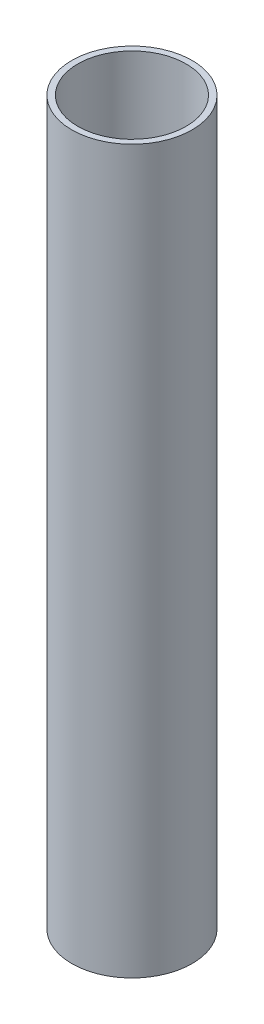
ISO-10303-21;
HEADER;
FILE_DESCRIPTION(('STEP AP214'),'2;1');
FILE_NAME('part.step','',(''),(''),'','','');
FILE_SCHEMA(('AUTOMOTIVE_DESIGN { 1 0 10303 214 1 1 1 1 }'));
ENDSEC;
DATA;
#1=APPLICATION_CONTEXT('core data for automotive mechanical design processes');
#2=APPLICATION_PROTOCOL_DEFINITION('international standard','automotive_design',2000,#1);
#3=PRODUCT_CONTEXT('',#1,'mechanical');
#4=PRODUCT('Part','Part','',(#3));
#5=PRODUCT_RELATED_PRODUCT_CATEGORY('part','',(#4));
#6=PRODUCT_DEFINITION_FORMATION('','',#4);
#7=PRODUCT_DEFINITION_CONTEXT('part definition',#1,'design');
#8=PRODUCT_DEFINITION('design','',#6,#7);
#9=PRODUCT_DEFINITION_SHAPE('','',#8);
#10=(LENGTH_UNIT() NAMED_UNIT(*) SI_UNIT(.MILLI.,.METRE.));
#11=(NAMED_UNIT(*) PLANE_ANGLE_UNIT() SI_UNIT($,.RADIAN.));
#12=(NAMED_UNIT(*) SI_UNIT($,.STERADIAN.) SOLID_ANGLE_UNIT());
#13=UNCERTAINTY_MEASURE_WITH_UNIT(LENGTH_MEASURE(1.E-05),#10,'distance_accuracy_value','');
#14=(GEOMETRIC_REPRESENTATION_CONTEXT(3) GLOBAL_UNCERTAINTY_ASSIGNED_CONTEXT((#13)) GLOBAL_UNIT_ASSIGNED_CONTEXT((#10,
#11,#12)) REPRESENTATION_CONTEXT('',''));
#15=CARTESIAN_POINT('',(0.,0.,0.));
#16=DIRECTION('',(0.,0.,1.));
#17=DIRECTION('',(1.,0.,0.));
#18=AXIS2_PLACEMENT_3D('',#15,#16,#17);
#19=CARTESIAN_POINT('',(0.,12.,0.));
#20=DIRECTION('',(0.,1.,0.));
#21=DIRECTION('',(0.,0.,1.));
#22=AXIS2_PLACEMENT_3D('',#19,#20,#21);
#23=PLANE('',#22);
#24=CARTESIAN_POINT('',(0.,12.,0.));
#25=DIRECTION('',(0.,1.,0.));
#26=DIRECTION('',(0.,0.,1.));
#27=AXIS2_PLACEMENT_3D('',#24,#25,#26);
#28=CIRCLE('',#27,1.);
#29=CARTESIAN_POINT('',(0.,12.,1.));
#30=VERTEX_POINT('',#29);
#31=EDGE_CURVE('E10',#30,#30,#28,.T.);
#32=ORIENTED_EDGE('',*,*,#31,.T.);
#33=EDGE_LOOP('',(#32));
#34=FACE_BOUND('',#33,.T.);
#35=CARTESIAN_POINT('',(0.,12.,0.));
#36=DIRECTION('',(0.,1.,0.));
#37=DIRECTION('',(0.,0.,1.));
#38=AXIS2_PLACEMENT_3D('',#35,#36,#37);
#39=CIRCLE('',#38,0.9);
#40=CARTESIAN_POINT('',(0.,12.,0.9));
#41=VERTEX_POINT('',#40);
#42=EDGE_CURVE('E52',#41,#41,#39,.T.);
#43=ORIENTED_EDGE('',*,*,#42,.F.);
#44=EDGE_LOOP('',(#43));
#45=FACE_BOUND('',#44,.T.);
#46=ADVANCED_FACE('F39',(#34,#45),#23,.T.);
#47=CARTESIAN_POINT('',(0.,0.,0.));
#48=DIRECTION('',(0.,1.,0.));
#49=DIRECTION('',(0.,0.,1.));
#50=AXIS2_PLACEMENT_3D('',#47,#48,#49);
#51=PLANE('',#50);
#52=CARTESIAN_POINT('',(0.,0.,0.));
#53=DIRECTION('',(0.,1.,0.));
#54=DIRECTION('',(0.,0.,1.));
#55=AXIS2_PLACEMENT_3D('',#52,#53,#54);
#56=CIRCLE('',#55,1.);
#57=CARTESIAN_POINT('',(0.,0.,1.));
#58=VERTEX_POINT('',#57);
#59=EDGE_CURVE('E43',#58,#58,#56,.T.);
#60=ORIENTED_EDGE('',*,*,#59,.F.);
#61=EDGE_LOOP('',(#60));
#62=FACE_BOUND('',#61,.T.);
#63=CARTESIAN_POINT('',(0.,0.,0.));
#64=DIRECTION('',(0.,1.,0.));
#65=DIRECTION('',(0.,0.,1.));
#66=AXIS2_PLACEMENT_3D('',#63,#64,#65);
#67=CIRCLE('',#66,0.9);
#68=CARTESIAN_POINT('',(0.,0.,0.9));
#69=VERTEX_POINT('',#68);
#70=EDGE_CURVE('E54',#69,#69,#67,.T.);
#71=ORIENTED_EDGE('',*,*,#70,.T.);
#72=EDGE_LOOP('',(#71));
#73=FACE_BOUND('',#72,.T.);
#74=ADVANCED_FACE('F66',(#62,#73),#51,.F.);
#75=CARTESIAN_POINT('',(0.,12.,0.));
#76=DIRECTION('',(0.,-1.,0.));
#77=DIRECTION('',(0.,0.,-1.));
#78=AXIS2_PLACEMENT_3D('',#75,#76,#77);
#79=CYLINDRICAL_SURFACE('',#78,1.);
#80=ORIENTED_EDGE('',*,*,#31,.F.);
#81=EDGE_LOOP('',(#80));
#82=FACE_BOUND('',#81,.T.);
#83=ORIENTED_EDGE('',*,*,#59,.T.);
#84=EDGE_LOOP('',(#83));
#85=FACE_BOUND('',#84,.T.);
#86=ADVANCED_FACE('F41',(#82,#85),#79,.T.);
#87=CARTESIAN_POINT('',(0.,12.,0.));
#88=DIRECTION('',(0.,-1.,0.));
#89=DIRECTION('',(0.,0.,-1.));
#90=AXIS2_PLACEMENT_3D('',#87,#88,#89);
#91=CYLINDRICAL_SURFACE('',#90,0.9);
#92=ORIENTED_EDGE('',*,*,#42,.T.);
#93=EDGE_LOOP('',(#92));
#94=FACE_BOUND('',#93,.T.);
#95=ORIENTED_EDGE('',*,*,#70,.F.);
#96=EDGE_LOOP('',(#95));
#97=FACE_BOUND('',#96,.T.);
#98=ADVANCED_FACE('F62',(#94,#97),#91,.F.);
#99=CLOSED_SHELL('',(#46,#74,#86,#98));
#100=MANIFOLD_SOLID_BREP('B2',#99);
#101=ADVANCED_BREP_SHAPE_REPRESENTATION('',(#18,#100),#14);
#102=SHAPE_DEFINITION_REPRESENTATION(#9,#101);
ENDSEC;
END-ISO-10303-21;
